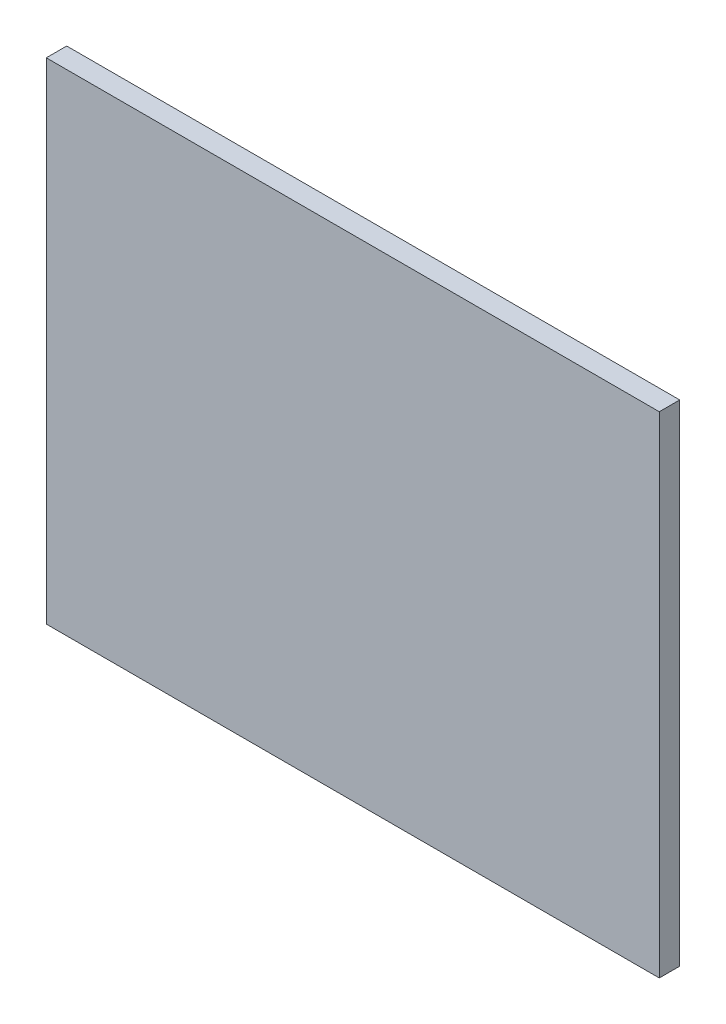
ISO-10303-21;
HEADER;
FILE_DESCRIPTION(('STEP AP214'),'2;1');
FILE_NAME('part.step','',(''),(''),'','','');
FILE_SCHEMA(('AUTOMOTIVE_DESIGN { 1 0 10303 214 1 1 1 1 }'));
ENDSEC;
DATA;
#1=APPLICATION_CONTEXT('core data for automotive mechanical design processes');
#2=APPLICATION_PROTOCOL_DEFINITION('international standard','automotive_design',2000,#1);
#3=PRODUCT_CONTEXT('',#1,'mechanical');
#4=PRODUCT('Part','Part','',(#3));
#5=PRODUCT_RELATED_PRODUCT_CATEGORY('part','',(#4));
#6=PRODUCT_DEFINITION_FORMATION('','',#4);
#7=PRODUCT_DEFINITION_CONTEXT('part definition',#1,'design');
#8=PRODUCT_DEFINITION('design','',#6,#7);
#9=PRODUCT_DEFINITION_SHAPE('','',#8);
#10=(LENGTH_UNIT() NAMED_UNIT(*) SI_UNIT(.MILLI.,.METRE.));
#11=(NAMED_UNIT(*) PLANE_ANGLE_UNIT() SI_UNIT($,.RADIAN.));
#12=(NAMED_UNIT(*) SI_UNIT($,.STERADIAN.) SOLID_ANGLE_UNIT());
#13=UNCERTAINTY_MEASURE_WITH_UNIT(LENGTH_MEASURE(1.E-05),#10,'distance_accuracy_value','');
#14=(GEOMETRIC_REPRESENTATION_CONTEXT(3) GLOBAL_UNCERTAINTY_ASSIGNED_CONTEXT((#13)) GLOBAL_UNIT_ASSIGNED_CONTEXT((#10,
#11,#12)) REPRESENTATION_CONTEXT('',''));
#15=CARTESIAN_POINT('',(0.,0.,0.));
#16=DIRECTION('',(0.,0.,1.));
#17=DIRECTION('',(1.,0.,0.));
#18=AXIS2_PLACEMENT_3D('',#15,#16,#17);
#19=CARTESIAN_POINT('',(-750.,-600.,50.));
#20=DIRECTION('',(1.,0.,0.));
#21=DIRECTION('',(0.,0.,-1.));
#22=AXIS2_PLACEMENT_3D('',#19,#20,#21);
#23=PLANE('',#22);
#24=DIRECTION('',(0.,-1.,0.));
#25=VECTOR('',#24,1.);
#26=CARTESIAN_POINT('',(-750.,-600.,0.));
#27=LINE('',#26,#25);
#28=CARTESIAN_POINT('',(-750.,600.,0.));
#29=VERTEX_POINT('',#28);
#30=CARTESIAN_POINT('',(-750.,-600.,0.));
#31=VERTEX_POINT('',#30);
#32=EDGE_CURVE('E96',#29,#31,#27,.T.);
#33=ORIENTED_EDGE('',*,*,#32,.T.);
#34=DIRECTION('',(0.,0.,-1.));
#35=VECTOR('',#34,1.);
#36=CARTESIAN_POINT('',(-750.,-600.,50.));
#37=LINE('',#36,#35);
#38=CARTESIAN_POINT('',(-750.,-600.,50.));
#39=VERTEX_POINT('',#38);
#40=EDGE_CURVE('E11',#39,#31,#37,.T.);
#41=ORIENTED_EDGE('',*,*,#40,.F.);
#42=DIRECTION('',(0.,-1.,0.));
#43=VECTOR('',#42,1.);
#44=CARTESIAN_POINT('',(-750.,-600.,50.));
#45=LINE('',#44,#43);
#46=CARTESIAN_POINT('',(-750.,600.,50.));
#47=VERTEX_POINT('',#46);
#48=EDGE_CURVE('E84',#47,#39,#45,.T.);
#49=ORIENTED_EDGE('',*,*,#48,.F.);
#50=DIRECTION('',(0.,0.,-1.));
#51=VECTOR('',#50,1.);
#52=CARTESIAN_POINT('',(-750.,600.,50.));
#53=LINE('',#52,#51);
#54=EDGE_CURVE('E92',#47,#29,#53,.T.);
#55=ORIENTED_EDGE('',*,*,#54,.T.);
#56=EDGE_LOOP('',(#33,#41,#49,#55));
#57=FACE_BOUND('',#56,.T.);
#58=ADVANCED_FACE('F33',(#57),#23,.F.);
#59=CARTESIAN_POINT('',(750.,-600.,50.));
#60=DIRECTION('',(0.,1.,0.));
#61=DIRECTION('',(-1.,0.,0.));
#62=AXIS2_PLACEMENT_3D('',#59,#60,#61);
#63=PLANE('',#62);
#64=DIRECTION('',(1.,0.,0.));
#65=VECTOR('',#64,1.);
#66=CARTESIAN_POINT('',(750.,-600.,0.));
#67=LINE('',#66,#65);
#68=CARTESIAN_POINT('',(750.,-600.,0.));
#69=VERTEX_POINT('',#68);
#70=EDGE_CURVE('E88',#31,#69,#67,.T.);
#71=ORIENTED_EDGE('',*,*,#70,.T.);
#72=DIRECTION('',(0.,0.,-1.));
#73=VECTOR('',#72,1.);
#74=CARTESIAN_POINT('',(750.,-600.,50.));
#75=LINE('',#74,#73);
#76=CARTESIAN_POINT('',(750.,-600.,50.));
#77=VERTEX_POINT('',#76);
#78=EDGE_CURVE('E41',#77,#69,#75,.T.);
#79=ORIENTED_EDGE('',*,*,#78,.F.);
#80=DIRECTION('',(1.,0.,0.));
#81=VECTOR('',#80,1.);
#82=CARTESIAN_POINT('',(750.,-600.,50.));
#83=LINE('',#82,#81);
#84=EDGE_CURVE('E79',#39,#77,#83,.T.);
#85=ORIENTED_EDGE('',*,*,#84,.F.);
#86=ORIENTED_EDGE('',*,*,#40,.T.);
#87=EDGE_LOOP('',(#71,#79,#85,#86));
#88=FACE_BOUND('',#87,.T.);
#89=ADVANCED_FACE('F87',(#88),#63,.F.);
#90=CARTESIAN_POINT('',(750.,-600.,50.));
#91=DIRECTION('',(-1.,0.,0.));
#92=DIRECTION('',(0.,0.,1.));
#93=AXIS2_PLACEMENT_3D('',#90,#91,#92);
#94=PLANE('',#93);
#95=DIRECTION('',(0.,1.,0.));
#96=VECTOR('',#95,1.);
#97=CARTESIAN_POINT('',(750.,-600.,0.));
#98=LINE('',#97,#96);
#99=CARTESIAN_POINT('',(750.,600.,0.));
#100=VERTEX_POINT('',#99);
#101=EDGE_CURVE('E66',#69,#100,#98,.T.);
#102=ORIENTED_EDGE('',*,*,#101,.T.);
#103=DIRECTION('',(0.,0.,-1.));
#104=VECTOR('',#103,1.);
#105=CARTESIAN_POINT('',(750.,600.,50.));
#106=LINE('',#105,#104);
#107=CARTESIAN_POINT('',(750.,600.,50.));
#108=VERTEX_POINT('',#107);
#109=EDGE_CURVE('E89',#108,#100,#106,.T.);
#110=ORIENTED_EDGE('',*,*,#109,.F.);
#111=DIRECTION('',(0.,1.,0.));
#112=VECTOR('',#111,1.);
#113=CARTESIAN_POINT('',(750.,-600.,50.));
#114=LINE('',#113,#112);
#115=EDGE_CURVE('E82',#77,#108,#114,.T.);
#116=ORIENTED_EDGE('',*,*,#115,.F.);
#117=ORIENTED_EDGE('',*,*,#78,.T.);
#118=EDGE_LOOP('',(#102,#110,#116,#117));
#119=FACE_BOUND('',#118,.T.);
#120=ADVANCED_FACE('F90',(#119),#94,.F.);
#121=CARTESIAN_POINT('',(750.,600.,50.));
#122=DIRECTION('',(0.,-1.,0.));
#123=DIRECTION('',(1.,0.,0.));
#124=AXIS2_PLACEMENT_3D('',#121,#122,#123);
#125=PLANE('',#124);
#126=DIRECTION('',(-1.,0.,0.));
#127=VECTOR('',#126,1.);
#128=CARTESIAN_POINT('',(750.,600.,0.));
#129=LINE('',#128,#127);
#130=EDGE_CURVE('E72',#100,#29,#129,.T.);
#131=ORIENTED_EDGE('',*,*,#130,.T.);
#132=ORIENTED_EDGE('',*,*,#54,.F.);
#133=DIRECTION('',(-1.,0.,0.));
#134=VECTOR('',#133,1.);
#135=CARTESIAN_POINT('',(750.,600.,50.));
#136=LINE('',#135,#134);
#137=EDGE_CURVE('E49',#108,#47,#136,.T.);
#138=ORIENTED_EDGE('',*,*,#137,.F.);
#139=ORIENTED_EDGE('',*,*,#109,.T.);
#140=EDGE_LOOP('',(#131,#132,#138,#139));
#141=FACE_BOUND('',#140,.T.);
#142=ADVANCED_FACE('F103',(#141),#125,.F.);
#143=CARTESIAN_POINT('',(0.,0.,50.));
#144=DIRECTION('',(0.,0.,1.));
#145=DIRECTION('',(1.,0.,0.));
#146=AXIS2_PLACEMENT_3D('',#143,#144,#145);
#147=PLANE('',#146);
#148=ORIENTED_EDGE('',*,*,#48,.T.);
#149=ORIENTED_EDGE('',*,*,#84,.T.);
#150=ORIENTED_EDGE('',*,*,#115,.T.);
#151=ORIENTED_EDGE('',*,*,#137,.T.);
#152=EDGE_LOOP('',(#148,#149,#150,#151));
#153=FACE_BOUND('',#152,.T.);
#154=ADVANCED_FACE('F80',(#153),#147,.T.);
#155=CARTESIAN_POINT('',(0.,0.,0.));
#156=DIRECTION('',(0.,0.,1.));
#157=DIRECTION('',(1.,0.,0.));
#158=AXIS2_PLACEMENT_3D('',#155,#156,#157);
#159=PLANE('',#158);
#160=ORIENTED_EDGE('',*,*,#32,.F.);
#161=ORIENTED_EDGE('',*,*,#130,.F.);
#162=ORIENTED_EDGE('',*,*,#101,.F.);
#163=ORIENTED_EDGE('',*,*,#70,.F.);
#164=EDGE_LOOP('',(#160,#161,#162,#163));
#165=FACE_BOUND('',#164,.T.);
#166=ADVANCED_FACE('F106',(#165),#159,.F.);
#167=CLOSED_SHELL('',(#58,#89,#120,#142,#154,#166));
#168=MANIFOLD_SOLID_BREP('B2',#167);
#169=ADVANCED_BREP_SHAPE_REPRESENTATION('',(#18,#168),#14);
#170=SHAPE_DEFINITION_REPRESENTATION(#9,#169);
ENDSEC;
END-ISO-10303-21;
